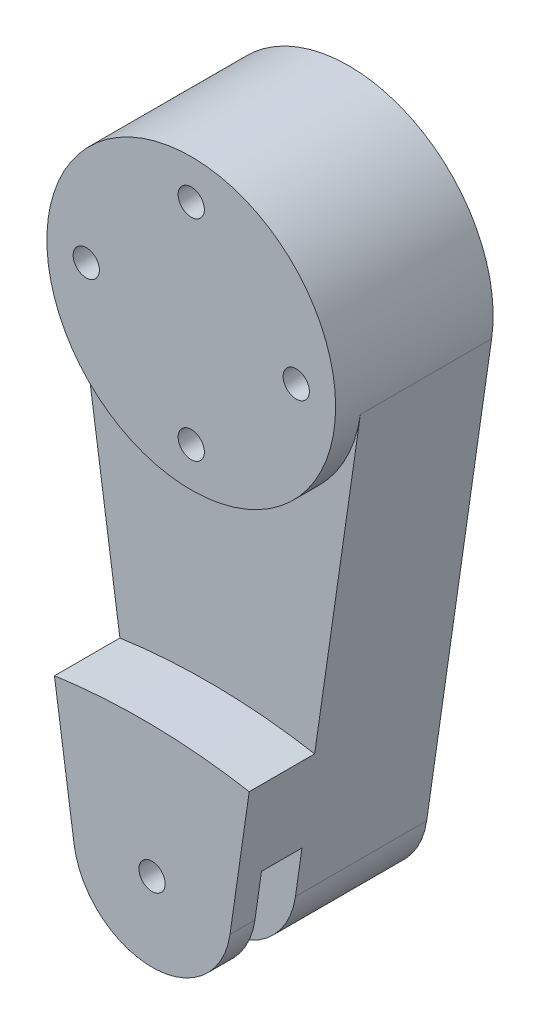
ISO-10303-21;
HEADER;
FILE_DESCRIPTION(('STEP AP214'),'2;1');
FILE_NAME('part.step','',(''),(''),'','','');
FILE_SCHEMA(('AUTOMOTIVE_DESIGN { 1 0 10303 214 1 1 1 1 }'));
ENDSEC;
DATA;
#1=APPLICATION_CONTEXT('core data for automotive mechanical design processes');
#2=APPLICATION_PROTOCOL_DEFINITION('international standard','automotive_design',2000,#1);
#3=PRODUCT_CONTEXT('',#1,'mechanical');
#4=PRODUCT('Part','Part','',(#3));
#5=PRODUCT_RELATED_PRODUCT_CATEGORY('part','',(#4));
#6=PRODUCT_DEFINITION_FORMATION('','',#4);
#7=PRODUCT_DEFINITION_CONTEXT('part definition',#1,'design');
#8=PRODUCT_DEFINITION('design','',#6,#7);
#9=PRODUCT_DEFINITION_SHAPE('','',#8);
#10=(LENGTH_UNIT() NAMED_UNIT(*) SI_UNIT(.MILLI.,.METRE.));
#11=(NAMED_UNIT(*) PLANE_ANGLE_UNIT() SI_UNIT($,.RADIAN.));
#12=(NAMED_UNIT(*) SI_UNIT($,.STERADIAN.) SOLID_ANGLE_UNIT());
#13=UNCERTAINTY_MEASURE_WITH_UNIT(LENGTH_MEASURE(1.E-05),#10,'distance_accuracy_value','');
#14=(GEOMETRIC_REPRESENTATION_CONTEXT(3) GLOBAL_UNCERTAINTY_ASSIGNED_CONTEXT((#13)) GLOBAL_UNIT_ASSIGNED_CONTEXT((#10,
#11,#12)) REPRESENTATION_CONTEXT('',''));
#15=CARTESIAN_POINT('',(0.,0.,0.));
#16=DIRECTION('',(0.,0.,1.));
#17=DIRECTION('',(1.,0.,0.));
#18=AXIS2_PLACEMENT_3D('',#15,#16,#17);
#19=CARTESIAN_POINT('',(-64.3745550146432,-324.,139.860706448977));
#20=DIRECTION('',(-0.612914989874306,0.790148856347574,0.));
#21=DIRECTION('',(-0.790148856347574,-0.612914989874306,0.));
#22=AXIS2_PLACEMENT_3D('',#19,#20,#21);
#23=PLANE('',#22);
#24=DIRECTION('',(0.790148856347574,0.612914989874306,0.));
#25=VECTOR('',#24,1.);
#26=CARTESIAN_POINT('',(-64.3745550146432,-324.,130.860706448977));
#27=LINE('',#26,#25);
#28=CARTESIAN_POINT('',(-64.3745550146432,-324.,130.860706448977));
#29=VERTEX_POINT('',#28);
#30=CARTESIAN_POINT('',(-36.7748993924584,-302.591068619146,130.860706448977));
#31=VERTEX_POINT('',#30);
#32=EDGE_CURVE('E60',#29,#31,#27,.T.);
#33=ORIENTED_EDGE('',*,*,#32,.F.);
#34=DIRECTION('',(0.,0.,-1.));
#35=VECTOR('',#34,1.);
#36=CARTESIAN_POINT('',(-64.3745550146432,-324.,139.860706448977));
#37=LINE('',#36,#35);
#38=CARTESIAN_POINT('',(-64.3745550146432,-324.,100.));
#39=VERTEX_POINT('',#38);
#40=EDGE_CURVE('E200',#29,#39,#37,.T.);
#41=ORIENTED_EDGE('',*,*,#40,.T.);
#42=DIRECTION('',(0.790148856347574,0.612914989874306,0.));
#43=VECTOR('',#42,1.);
#44=CARTESIAN_POINT('',(-64.3745550146432,-324.,100.));
#45=LINE('',#44,#43);
#46=CARTESIAN_POINT('',(-36.7748993924584,-302.591068619146,100.));
#47=VERTEX_POINT('',#46);
#48=EDGE_CURVE('E177',#39,#47,#45,.T.);
#49=ORIENTED_EDGE('',*,*,#48,.T.);
#50=DIRECTION('',(0.,0.,-1.));
#51=VECTOR('',#50,1.);
#52=CARTESIAN_POINT('',(-36.7748993924584,-302.591068619146,139.860706448977));
#53=LINE('',#52,#51);
#54=EDGE_CURVE('E199',#31,#47,#53,.T.);
#55=ORIENTED_EDGE('',*,*,#54,.F.);
#56=EDGE_LOOP('',(#33,#41,#49,#55));
#57=FACE_BOUND('',#56,.T.);
#58=ADVANCED_FACE('F41',(#57),#23,.F.);
#59=CARTESIAN_POINT('',(0.,-350.,139.860706448977));
#60=DIRECTION('',(0.,0.,-1.));
#61=DIRECTION('',(-1.,0.,0.));
#62=AXIS2_PLACEMENT_3D('',#59,#60,#61);
#63=CYLINDRICAL_SURFACE('',#62,60.);
#64=CARTESIAN_POINT('',(0.,-350.,130.860706448977));
#65=DIRECTION('',(0.,0.,1.));
#66=DIRECTION('',(1.,0.,0.));
#67=AXIS2_PLACEMENT_3D('',#64,#65,#66);
#68=CIRCLE('',#67,60.);
#69=CARTESIAN_POINT('',(36.7748993924584,-302.591068619146,130.860706448977));
#70=VERTEX_POINT('',#69);
#71=EDGE_CURVE('E63',#31,#70,#68,.F.);
#72=ORIENTED_EDGE('',*,*,#71,.F.);
#73=ORIENTED_EDGE('',*,*,#54,.T.);
#74=CARTESIAN_POINT('',(0.,-350.,100.));
#75=DIRECTION('',(0.,0.,-1.));
#76=DIRECTION('',(1.,0.,0.));
#77=AXIS2_PLACEMENT_3D('',#74,#75,#76);
#78=CIRCLE('',#77,60.);
#79=CARTESIAN_POINT('',(36.7748993924584,-302.591068619146,100.));
#80=VERTEX_POINT('',#79);
#81=EDGE_CURVE('E185',#47,#80,#78,.T.);
#82=ORIENTED_EDGE('',*,*,#81,.T.);
#83=DIRECTION('',(0.,0.,-1.));
#84=VECTOR('',#83,1.);
#85=CARTESIAN_POINT('',(36.7748993924584,-302.591068619146,139.860706448977));
#86=LINE('',#85,#84);
#87=EDGE_CURVE('E196',#70,#80,#86,.T.);
#88=ORIENTED_EDGE('',*,*,#87,.F.);
#89=EDGE_LOOP('',(#72,#73,#82,#88));
#90=FACE_BOUND('',#89,.T.);
#91=ADVANCED_FACE('F298',(#90),#63,.F.);
#92=CARTESIAN_POINT('',(64.3745550146433,-324.,139.860706448977));
#93=DIRECTION('',(0.612914989874306,0.790148856347574,0.));
#94=DIRECTION('',(-0.790148856347574,0.612914989874307,0.));
#95=AXIS2_PLACEMENT_3D('',#92,#93,#94);
#96=PLANE('',#95);
#97=DIRECTION('',(0.790148856347574,-0.612914989874307,0.));
#98=VECTOR('',#97,1.);
#99=CARTESIAN_POINT('',(64.3745550146433,-324.,130.860706448977));
#100=LINE('',#99,#98);
#101=CARTESIAN_POINT('',(64.3745550146433,-324.,130.860706448977));
#102=VERTEX_POINT('',#101);
#103=EDGE_CURVE('E173',#70,#102,#100,.T.);
#104=ORIENTED_EDGE('',*,*,#103,.F.);
#105=ORIENTED_EDGE('',*,*,#87,.T.);
#106=DIRECTION('',(0.790148856347574,-0.612914989874306,0.));
#107=VECTOR('',#106,1.);
#108=CARTESIAN_POINT('',(64.3745550146433,-324.,100.));
#109=LINE('',#108,#107);
#110=CARTESIAN_POINT('',(64.3745550146433,-324.,100.));
#111=VERTEX_POINT('',#110);
#112=EDGE_CURVE('E184',#80,#111,#109,.T.);
#113=ORIENTED_EDGE('',*,*,#112,.T.);
#114=DIRECTION('',(0.,0.,-1.));
#115=VECTOR('',#114,1.);
#116=CARTESIAN_POINT('',(64.3745550146433,-324.,139.860706448977));
#117=LINE('',#116,#115);
#118=EDGE_CURVE('E191',#102,#111,#117,.T.);
#119=ORIENTED_EDGE('',*,*,#118,.F.);
#120=EDGE_LOOP('',(#104,#105,#113,#119));
#121=FACE_BOUND('',#120,.T.);
#122=ADVANCED_FACE('F294',(#121),#96,.F.);
#123=CARTESIAN_POINT('',(0.,-350.,100.));
#124=DIRECTION('',(0.,0.,1.));
#125=DIRECTION('',(1.,0.,0.));
#126=AXIS2_PLACEMENT_3D('',#123,#124,#125);
#127=PLANE('',#126);
#128=CARTESIAN_POINT('',(-7.21687836487018,-720.,100.));
#129=DIRECTION('',(0.,0.,1.));
#130=DIRECTION('',(-1.,0.,0.));
#131=AXIS2_PLACEMENT_3D('',#128,#129,#130);
#132=CIRCLE('',#131,470.);
#133=CARTESIAN_POINT('',(74.0341464313362,-257.076387543726,100.));
#134=VERTEX_POINT('',#133);
#135=CARTESIAN_POINT('',(-74.3597355077275,-254.82064025293,100.));
#136=VERTEX_POINT('',#135);
#137=EDGE_CURVE('E189',#134,#136,#132,.T.);
#138=ORIENTED_EDGE('',*,*,#137,.F.);
#139=DIRECTION('',(0.142857142857143,0.989743318610787,0.));
#140=VECTOR('',#139,1.);
#141=CARTESIAN_POINT('',(59.3845991166472,-358.571428571429,100.));
#142=LINE('',#141,#140);
#143=CARTESIAN_POINT('',(108.871765047187,-15.7142857142858,100.));
#144=VERTEX_POINT('',#143);
#145=EDGE_CURVE('E244',#134,#144,#142,.T.);
#146=ORIENTED_EDGE('',*,*,#145,.T.);
#147=CARTESIAN_POINT('',(0.,0.,100.));
#148=DIRECTION('',(0.,0.,1.));
#149=DIRECTION('',(1.,0.,0.));
#150=AXIS2_PLACEMENT_3D('',#147,#148,#149);
#151=CIRCLE('',#150,110.);
#152=CARTESIAN_POINT('',(-108.871765047187,-15.7142857142857,100.));
#153=VERTEX_POINT('',#152);
#154=EDGE_CURVE('E232',#153,#144,#151,.T.);
#155=ORIENTED_EDGE('',*,*,#154,.F.);
#156=DIRECTION('',(0.142857142857143,-0.989743318610787,0.));
#157=VECTOR('',#156,1.);
#158=CARTESIAN_POINT('',(-59.3845991166472,-358.571428571429,100.));
#159=LINE('',#158,#157);
#160=EDGE_CURVE('E252',#153,#136,#159,.T.);
#161=ORIENTED_EDGE('',*,*,#160,.T.);
#162=EDGE_LOOP('',(#138,#146,#155,#161));
#163=FACE_BOUND('',#162,.T.);
#164=ADVANCED_FACE('F344',(#163),#127,.T.);
#165=CARTESIAN_POINT('',(0.,-350.,100.));
#166=DIRECTION('',(0.,0.,1.));
#167=DIRECTION('',(1.,0.,0.));
#168=AXIS2_PLACEMENT_3D('',#165,#166,#167);
#169=CIRCLE('',#168,10.);
#170=CARTESIAN_POINT('',(-10.,-350.,100.));
#171=VERTEX_POINT('',#170);
#172=EDGE_CURVE('E44',#171,#171,#169,.F.);
#173=ORIENTED_EDGE('',*,*,#172,.T.);
#174=EDGE_LOOP('',(#173));
#175=FACE_BOUND('',#174,.T.);
#176=ORIENTED_EDGE('',*,*,#112,.F.);
#177=ORIENTED_EDGE('',*,*,#81,.F.);
#178=ORIENTED_EDGE('',*,*,#48,.F.);
#179=CARTESIAN_POINT('',(-59.3845991166472,-358.571428571429,100.));
#180=VERTEX_POINT('',#179);
#181=EDGE_CURVE('E249',#39,#180,#159,.T.);
#182=ORIENTED_EDGE('',*,*,#181,.T.);
#183=CARTESIAN_POINT('',(0.,-350.,100.));
#184=DIRECTION('',(0.,0.,1.));
#185=DIRECTION('',(1.,0.,0.));
#186=AXIS2_PLACEMENT_3D('',#183,#184,#185);
#187=CIRCLE('',#186,60.);
#188=CARTESIAN_POINT('',(59.3845991166472,-358.571428571429,100.));
#189=VERTEX_POINT('',#188);
#190=EDGE_CURVE('E245',#180,#189,#187,.T.);
#191=ORIENTED_EDGE('',*,*,#190,.T.);
#192=EDGE_CURVE('E250',#189,#111,#142,.T.);
#193=ORIENTED_EDGE('',*,*,#192,.T.);
#194=EDGE_LOOP('',(#176,#177,#178,#182,#191,#193));
#195=FACE_BOUND('',#194,.T.);
#196=ADVANCED_FACE('F287',(#175,#195),#127,.T.);
#197=CARTESIAN_POINT('',(0.,-350.,100.));
#198=DIRECTION('',(0.,0.,-1.));
#199=DIRECTION('',(-1.,0.,0.));
#200=AXIS2_PLACEMENT_3D('',#197,#198,#199);
#201=CYLINDRICAL_SURFACE('',#200,60.);
#202=CARTESIAN_POINT('',(0.,-350.,0.));
#203=DIRECTION('',(0.,0.,1.));
#204=DIRECTION('',(1.,0.,0.));
#205=AXIS2_PLACEMENT_3D('',#202,#203,#204);
#206=CIRCLE('',#205,60.);
#207=CARTESIAN_POINT('',(-59.3845991166472,-358.571428571429,0.));
#208=VERTEX_POINT('',#207);
#209=CARTESIAN_POINT('',(59.3845991166472,-358.571428571429,0.));
#210=VERTEX_POINT('',#209);
#211=EDGE_CURVE('E237',#208,#210,#206,.T.);
#212=ORIENTED_EDGE('',*,*,#211,.T.);
#213=DIRECTION('',(0.,0.,-1.));
#214=VECTOR('',#213,1.);
#215=CARTESIAN_POINT('',(59.3845991166472,-358.571428571429,100.));
#216=LINE('',#215,#214);
#217=EDGE_CURVE('E11',#189,#210,#216,.T.);
#218=ORIENTED_EDGE('',*,*,#217,.F.);
#219=ORIENTED_EDGE('',*,*,#190,.F.);
#220=DIRECTION('',(0.,0.,-1.));
#221=VECTOR('',#220,1.);
#222=CARTESIAN_POINT('',(-59.3845991166472,-358.571428571429,100.));
#223=LINE('',#222,#221);
#224=EDGE_CURVE('E251',#180,#208,#223,.T.);
#225=ORIENTED_EDGE('',*,*,#224,.T.);
#226=EDGE_LOOP('',(#212,#218,#219,#225));
#227=FACE_BOUND('',#226,.T.);
#228=ADVANCED_FACE('F43',(#227),#201,.T.);
#229=CARTESIAN_POINT('',(59.3845991166472,-358.571428571429,100.));
#230=DIRECTION('',(-0.989743318610787,0.142857142857143,0.));
#231=DIRECTION('',(-0.142857142857143,-0.989743318610787,0.));
#232=AXIS2_PLACEMENT_3D('',#229,#230,#231);
#233=PLANE('',#232);
#234=DIRECTION('',(0.,0.,-1.));
#235=VECTOR('',#234,1.);
#236=CARTESIAN_POINT('',(74.0341464313362,-257.076387543726,139.860706448977));
#237=LINE('',#236,#235);
#238=CARTESIAN_POINT('',(74.0341464313363,-257.076387543726,149.860706448977));
#239=VERTEX_POINT('',#238);
#240=EDGE_CURVE('E148',#239,#134,#237,.T.);
#241=ORIENTED_EDGE('',*,*,#240,.F.);
#242=DIRECTION('',(0.142857142857143,0.989743318610787,0.));
#243=VECTOR('',#242,1.);
#244=CARTESIAN_POINT('',(74.0341464313362,-257.076387543726,149.860706448977));
#245=LINE('',#244,#243);
#246=CARTESIAN_POINT('',(59.3845991166472,-358.571428571429,149.860706448977));
#247=VERTEX_POINT('',#246);
#248=EDGE_CURVE('E150',#247,#239,#245,.T.);
#249=ORIENTED_EDGE('',*,*,#248,.F.);
#250=DIRECTION('',(0.,0.,1.));
#251=VECTOR('',#250,1.);
#252=CARTESIAN_POINT('',(59.3845991166472,-358.571428571429,130.860706448977));
#253=LINE('',#252,#251);
#254=CARTESIAN_POINT('',(59.3845991166472,-358.571428571429,130.860706448977));
#255=VERTEX_POINT('',#254);
#256=EDGE_CURVE('E132',#255,#247,#253,.T.);
#257=ORIENTED_EDGE('',*,*,#256,.F.);
#258=DIRECTION('',(0.142857142857143,0.989743318610787,0.));
#259=VECTOR('',#258,1.);
#260=CARTESIAN_POINT('',(74.0341464313362,-257.076387543726,130.860706448977));
#261=LINE('',#260,#259);
#262=EDGE_CURVE('E167',#255,#102,#261,.T.);
#263=ORIENTED_EDGE('',*,*,#262,.T.);
#264=ORIENTED_EDGE('',*,*,#118,.T.);
#265=ORIENTED_EDGE('',*,*,#192,.F.);
#266=ORIENTED_EDGE('',*,*,#217,.T.);
#267=DIRECTION('',(0.142857142857143,0.989743318610787,0.));
#268=VECTOR('',#267,1.);
#269=CARTESIAN_POINT('',(59.3845991166472,-358.571428571429,0.));
#270=LINE('',#269,#268);
#271=CARTESIAN_POINT('',(108.871765047187,-15.7142857142858,0.));
#272=VERTEX_POINT('',#271);
#273=EDGE_CURVE('E260',#210,#272,#270,.T.);
#274=ORIENTED_EDGE('',*,*,#273,.T.);
#275=DIRECTION('',(0.,0.,-1.));
#276=VECTOR('',#275,1.);
#277=CARTESIAN_POINT('',(108.871765047187,-15.7142857142858,100.));
#278=LINE('',#277,#276);
#279=EDGE_CURVE('E49',#144,#272,#278,.T.);
#280=ORIENTED_EDGE('',*,*,#279,.F.);
#281=ORIENTED_EDGE('',*,*,#145,.F.);
#282=EDGE_LOOP('',(#241,#249,#257,#263,#264,#265,#266,#274,#280,#281));
#283=FACE_BOUND('',#282,.T.);
#284=ADVANCED_FACE('F149',(#283),#233,.F.);
#285=CARTESIAN_POINT('',(0.,0.,100.));
#286=DIRECTION('',(0.,0.,-1.));
#287=DIRECTION('',(-1.,0.,0.));
#288=AXIS2_PLACEMENT_3D('',#285,#286,#287);
#289=CYLINDRICAL_SURFACE('',#288,110.);
#290=CARTESIAN_POINT('',(0.,0.,0.));
#291=DIRECTION('',(0.,0.,1.));
#292=DIRECTION('',(1.,0.,0.));
#293=AXIS2_PLACEMENT_3D('',#290,#291,#292);
#294=CIRCLE('',#293,110.);
#295=CARTESIAN_POINT('',(-108.871765047187,-15.7142857142857,0.));
#296=VERTEX_POINT('',#295);
#297=EDGE_CURVE('E256',#272,#296,#294,.T.);
#298=ORIENTED_EDGE('',*,*,#297,.T.);
#299=DIRECTION('',(0.,0.,-1.));
#300=VECTOR('',#299,1.);
#301=CARTESIAN_POINT('',(-108.871765047187,-15.7142857142857,100.));
#302=LINE('',#301,#300);
#303=EDGE_CURVE('E263',#153,#296,#302,.T.);
#304=ORIENTED_EDGE('',*,*,#303,.F.);
#305=ORIENTED_EDGE('',*,*,#154,.T.);
#306=ORIENTED_EDGE('',*,*,#279,.T.);
#307=EDGE_LOOP('',(#298,#304,#305,#306));
#308=FACE_BOUND('',#307,.T.);
#309=CARTESIAN_POINT('',(0.,0.,120.));
#310=DIRECTION('',(0.,0.,1.));
#311=DIRECTION('',(1.,0.,0.));
#312=AXIS2_PLACEMENT_3D('',#309,#310,#311);
#313=CIRCLE('',#312,110.);
#314=CARTESIAN_POINT('',(110.,0.,120.));
#315=VERTEX_POINT('',#314);
#316=EDGE_CURVE('E236',#315,#315,#313,.T.);
#317=ORIENTED_EDGE('',*,*,#316,.F.);
#318=EDGE_LOOP('',(#317));
#319=FACE_BOUND('',#318,.T.);
#320=ADVANCED_FACE('F272',(#308,#319),#289,.T.);
#321=CARTESIAN_POINT('',(-59.3845991166472,-358.571428571429,100.));
#322=DIRECTION('',(0.989743318610787,0.142857142857143,0.));
#323=DIRECTION('',(-0.142857142857143,0.989743318610787,0.));
#324=AXIS2_PLACEMENT_3D('',#321,#322,#323);
#325=PLANE('',#324);
#326=ORIENTED_EDGE('',*,*,#40,.F.);
#327=DIRECTION('',(0.142857142857143,-0.989743318610787,0.));
#328=VECTOR('',#327,1.);
#329=CARTESIAN_POINT('',(-59.3845991166472,-358.571428571429,130.860706448977));
#330=LINE('',#329,#328);
#331=CARTESIAN_POINT('',(-59.3845991166472,-358.571428571429,130.860706448977));
#332=VERTEX_POINT('',#331);
#333=EDGE_CURVE('E144',#29,#332,#330,.T.);
#334=ORIENTED_EDGE('',*,*,#333,.T.);
#335=DIRECTION('',(0.,0.,1.));
#336=VECTOR('',#335,1.);
#337=CARTESIAN_POINT('',(-59.3845991166472,-358.571428571429,130.860706448977));
#338=LINE('',#337,#336);
#339=CARTESIAN_POINT('',(-59.3845991166472,-358.571428571429,149.860706448977));
#340=VERTEX_POINT('',#339);
#341=EDGE_CURVE('E141',#332,#340,#338,.T.);
#342=ORIENTED_EDGE('',*,*,#341,.T.);
#343=DIRECTION('',(0.142857142857143,-0.989743318610787,0.));
#344=VECTOR('',#343,1.);
#345=CARTESIAN_POINT('',(-59.3845991166472,-358.571428571429,149.860706448977));
#346=LINE('',#345,#344);
#347=CARTESIAN_POINT('',(-74.3597355077274,-254.82064025293,149.860706448977));
#348=VERTEX_POINT('',#347);
#349=EDGE_CURVE('E160',#348,#340,#346,.T.);
#350=ORIENTED_EDGE('',*,*,#349,.F.);
#351=DIRECTION('',(0.,0.,-1.));
#352=VECTOR('',#351,1.);
#353=CARTESIAN_POINT('',(-74.3597355077275,-254.82064025293,139.860706448977));
#354=LINE('',#353,#352);
#355=EDGE_CURVE('E192',#348,#136,#354,.T.);
#356=ORIENTED_EDGE('',*,*,#355,.T.);
#357=ORIENTED_EDGE('',*,*,#160,.F.);
#358=ORIENTED_EDGE('',*,*,#303,.T.);
#359=DIRECTION('',(0.142857142857143,-0.989743318610787,0.));
#360=VECTOR('',#359,1.);
#361=CARTESIAN_POINT('',(-59.3845991166472,-358.571428571429,0.));
#362=LINE('',#361,#360);
#363=EDGE_CURVE('E246',#296,#208,#362,.T.);
#364=ORIENTED_EDGE('',*,*,#363,.T.);
#365=ORIENTED_EDGE('',*,*,#224,.F.);
#366=ORIENTED_EDGE('',*,*,#181,.F.);
#367=EDGE_LOOP('',(#326,#334,#342,#350,#356,#357,#358,#364,#365,#366));
#368=FACE_BOUND('',#367,.T.);
#369=ADVANCED_FACE('F281',(#368),#325,.F.);
#370=CARTESIAN_POINT('',(0.,-350.,0.));
#371=DIRECTION('',(0.,0.,1.));
#372=DIRECTION('',(1.,0.,0.));
#373=AXIS2_PLACEMENT_3D('',#370,#371,#372);
#374=PLANE('',#373);
#375=CARTESIAN_POINT('',(0.,0.,0.));
#376=DIRECTION('',(0.,0.,1.));
#377=DIRECTION('',(1.,0.,0.));
#378=AXIS2_PLACEMENT_3D('',#375,#376,#377);
#379=CIRCLE('',#378,10.);
#380=CARTESIAN_POINT('',(10.,0.,0.));
#381=VERTEX_POINT('',#380);
#382=EDGE_CURVE('E204',#381,#381,#379,.T.);
#383=ORIENTED_EDGE('',*,*,#382,.T.);
#384=EDGE_LOOP('',(#383));
#385=FACE_BOUND('',#384,.T.);
#386=CARTESIAN_POINT('',(80.,0.,0.));
#387=DIRECTION('',(0.,0.,1.));
#388=DIRECTION('',(1.,0.,0.));
#389=AXIS2_PLACEMENT_3D('',#386,#387,#388);
#390=CIRCLE('',#389,9.99999999999999);
#391=CARTESIAN_POINT('',(90.,0.,0.));
#392=VERTEX_POINT('',#391);
#393=EDGE_CURVE('E211',#392,#392,#390,.T.);
#394=ORIENTED_EDGE('',*,*,#393,.T.);
#395=EDGE_LOOP('',(#394));
#396=FACE_BOUND('',#395,.T.);
#397=CARTESIAN_POINT('',(0.,80.,0.));
#398=DIRECTION('',(0.,0.,1.));
#399=DIRECTION('',(1.,0.,0.));
#400=AXIS2_PLACEMENT_3D('',#397,#398,#399);
#401=CIRCLE('',#400,10.);
#402=CARTESIAN_POINT('',(9.99999999999999,80.,0.));
#403=VERTEX_POINT('',#402);
#404=EDGE_CURVE('E220',#403,#403,#401,.T.);
#405=ORIENTED_EDGE('',*,*,#404,.T.);
#406=EDGE_LOOP('',(#405));
#407=FACE_BOUND('',#406,.T.);
#408=CARTESIAN_POINT('',(0.,-80.,0.));
#409=DIRECTION('',(0.,0.,1.));
#410=DIRECTION('',(1.,0.,0.));
#411=AXIS2_PLACEMENT_3D('',#408,#409,#410);
#412=CIRCLE('',#411,10.);
#413=CARTESIAN_POINT('',(10.,-80.,0.));
#414=VERTEX_POINT('',#413);
#415=EDGE_CURVE('E228',#414,#414,#412,.T.);
#416=ORIENTED_EDGE('',*,*,#415,.T.);
#417=EDGE_LOOP('',(#416));
#418=FACE_BOUND('',#417,.T.);
#419=CARTESIAN_POINT('',(-80.,0.,0.));
#420=DIRECTION('',(0.,0.,1.));
#421=DIRECTION('',(1.,0.,0.));
#422=AXIS2_PLACEMENT_3D('',#419,#420,#421);
#423=CIRCLE('',#422,9.99999999999999);
#424=CARTESIAN_POINT('',(-70.,0.,0.));
#425=VERTEX_POINT('',#424);
#426=EDGE_CURVE('E235',#425,#425,#423,.T.);
#427=ORIENTED_EDGE('',*,*,#426,.T.);
#428=EDGE_LOOP('',(#427));
#429=FACE_BOUND('',#428,.T.);
#430=ORIENTED_EDGE('',*,*,#211,.F.);
#431=ORIENTED_EDGE('',*,*,#363,.F.);
#432=ORIENTED_EDGE('',*,*,#297,.F.);
#433=ORIENTED_EDGE('',*,*,#273,.F.);
#434=EDGE_LOOP('',(#430,#431,#432,#433));
#435=FACE_BOUND('',#434,.T.);
#436=ADVANCED_FACE('F279',(#385,#396,#407,#418,#429,#435),#374,.F.);
#437=CARTESIAN_POINT('',(0.,0.,120.));
#438=DIRECTION('',(0.,0.,1.));
#439=DIRECTION('',(1.,0.,0.));
#440=AXIS2_PLACEMENT_3D('',#437,#438,#439);
#441=PLANE('',#440);
#442=CARTESIAN_POINT('',(80.,0.,120.));
#443=DIRECTION('',(0.,0.,1.));
#444=DIRECTION('',(1.,0.,0.));
#445=AXIS2_PLACEMENT_3D('',#442,#443,#444);
#446=CIRCLE('',#445,10.);
#447=CARTESIAN_POINT('',(90.,0.,120.));
#448=VERTEX_POINT('',#447);
#449=EDGE_CURVE('E212',#448,#448,#446,.T.);
#450=ORIENTED_EDGE('',*,*,#449,.F.);
#451=EDGE_LOOP('',(#450));
#452=FACE_BOUND('',#451,.T.);
#453=CARTESIAN_POINT('',(0.,80.,120.));
#454=DIRECTION('',(0.,0.,1.));
#455=DIRECTION('',(1.,0.,0.));
#456=AXIS2_PLACEMENT_3D('',#453,#454,#455);
#457=CIRCLE('',#456,10.);
#458=CARTESIAN_POINT('',(10.,80.,120.));
#459=VERTEX_POINT('',#458);
#460=EDGE_CURVE('E217',#459,#459,#457,.T.);
#461=ORIENTED_EDGE('',*,*,#460,.F.);
#462=EDGE_LOOP('',(#461));
#463=FACE_BOUND('',#462,.T.);
#464=CARTESIAN_POINT('',(0.,-80.,120.));
#465=DIRECTION('',(0.,0.,1.));
#466=DIRECTION('',(1.,0.,0.));
#467=AXIS2_PLACEMENT_3D('',#464,#465,#466);
#468=CIRCLE('',#467,10.);
#469=CARTESIAN_POINT('',(10.,-80.,120.));
#470=VERTEX_POINT('',#469);
#471=EDGE_CURVE('E222',#470,#470,#468,.T.);
#472=ORIENTED_EDGE('',*,*,#471,.F.);
#473=EDGE_LOOP('',(#472));
#474=FACE_BOUND('',#473,.T.);
#475=CARTESIAN_POINT('',(-80.,0.,120.));
#476=DIRECTION('',(0.,0.,1.));
#477=DIRECTION('',(1.,0.,0.));
#478=AXIS2_PLACEMENT_3D('',#475,#476,#477);
#479=CIRCLE('',#478,10.);
#480=CARTESIAN_POINT('',(-70.,0.,120.));
#481=VERTEX_POINT('',#480);
#482=EDGE_CURVE('E230',#481,#481,#479,.T.);
#483=ORIENTED_EDGE('',*,*,#482,.F.);
#484=EDGE_LOOP('',(#483));
#485=FACE_BOUND('',#484,.T.);
#486=ORIENTED_EDGE('',*,*,#316,.T.);
#487=EDGE_LOOP('',(#486));
#488=FACE_BOUND('',#487,.T.);
#489=ADVANCED_FACE('F336',(#452,#463,#474,#485,#488),#441,.T.);
#490=CARTESIAN_POINT('',(-80.,0.,120.));
#491=DIRECTION('',(0.,0.,1.));
#492=DIRECTION('',(1.,0.,0.));
#493=AXIS2_PLACEMENT_3D('',#490,#491,#492);
#494=CYLINDRICAL_SURFACE('',#493,10.);
#495=ORIENTED_EDGE('',*,*,#426,.F.);
#496=EDGE_LOOP('',(#495));
#497=FACE_BOUND('',#496,.T.);
#498=ORIENTED_EDGE('',*,*,#482,.T.);
#499=EDGE_LOOP('',(#498));
#500=FACE_BOUND('',#499,.T.);
#501=ADVANCED_FACE('F335',(#497,#500),#494,.F.);
#502=CARTESIAN_POINT('',(0.,-80.,120.));
#503=DIRECTION('',(0.,0.,1.));
#504=DIRECTION('',(1.,0.,0.));
#505=AXIS2_PLACEMENT_3D('',#502,#503,#504);
#506=CYLINDRICAL_SURFACE('',#505,10.);
#507=ORIENTED_EDGE('',*,*,#415,.F.);
#508=EDGE_LOOP('',(#507));
#509=FACE_BOUND('',#508,.T.);
#510=ORIENTED_EDGE('',*,*,#471,.T.);
#511=EDGE_LOOP('',(#510));
#512=FACE_BOUND('',#511,.T.);
#513=ADVANCED_FACE('F330',(#509,#512),#506,.F.);
#514=CARTESIAN_POINT('',(0.,80.,120.));
#515=DIRECTION('',(0.,0.,1.));
#516=DIRECTION('',(1.,0.,0.));
#517=AXIS2_PLACEMENT_3D('',#514,#515,#516);
#518=CYLINDRICAL_SURFACE('',#517,10.);
#519=ORIENTED_EDGE('',*,*,#404,.F.);
#520=EDGE_LOOP('',(#519));
#521=FACE_BOUND('',#520,.T.);
#522=ORIENTED_EDGE('',*,*,#460,.T.);
#523=EDGE_LOOP('',(#522));
#524=FACE_BOUND('',#523,.T.);
#525=ADVANCED_FACE('F326',(#521,#524),#518,.F.);
#526=CARTESIAN_POINT('',(80.,0.,120.));
#527=DIRECTION('',(0.,0.,1.));
#528=DIRECTION('',(1.,0.,0.));
#529=AXIS2_PLACEMENT_3D('',#526,#527,#528);
#530=CYLINDRICAL_SURFACE('',#529,10.);
#531=ORIENTED_EDGE('',*,*,#393,.F.);
#532=EDGE_LOOP('',(#531));
#533=FACE_BOUND('',#532,.T.);
#534=ORIENTED_EDGE('',*,*,#449,.T.);
#535=EDGE_LOOP('',(#534));
#536=FACE_BOUND('',#535,.T.);
#537=ADVANCED_FACE('F325',(#533,#536),#530,.F.);
#538=CARTESIAN_POINT('',(0.,-350.,218.));
#539=DIRECTION('',(0.,0.,-1.));
#540=DIRECTION('',(-1.,0.,0.));
#541=AXIS2_PLACEMENT_3D('',#538,#539,#540);
#542=CYLINDRICAL_SURFACE('',#541,10.);
#543=CARTESIAN_POINT('',(0.,-350.,70.));
#544=DIRECTION('',(0.,0.,1.));
#545=DIRECTION('',(1.,0.,0.));
#546=AXIS2_PLACEMENT_3D('',#543,#544,#545);
#547=CIRCLE('',#546,10.);
#548=CARTESIAN_POINT('',(-10.,-350.,70.));
#549=VERTEX_POINT('',#548);
#550=EDGE_CURVE('E207',#549,#549,#547,.T.);
#551=CARTESIAN_POINT('',(-10.,-350.,100.));
#552=CARTESIAN_POINT('',(-10.,-350.,99.6875));
#553=CARTESIAN_POINT('',(-10.,-350.,99.375));
#554=CARTESIAN_POINT('',(-10.,-350.,98.75));
#555=CARTESIAN_POINT('',(-10.,-350.,98.4375));
#556=CARTESIAN_POINT('',(-10.,-350.,97.8125));
#557=CARTESIAN_POINT('',(-10.,-350.,97.5));
#558=CARTESIAN_POINT('',(-10.,-350.,96.875));
#559=CARTESIAN_POINT('',(-10.,-350.,96.5625));
#560=CARTESIAN_POINT('',(-10.,-350.,95.9375));
#561=CARTESIAN_POINT('',(-10.,-350.,95.625));
#562=CARTESIAN_POINT('',(-10.,-350.,95.));
#563=CARTESIAN_POINT('',(-10.,-350.,94.6875));
#564=CARTESIAN_POINT('',(-10.,-350.,94.0625));
#565=CARTESIAN_POINT('',(-10.,-350.,93.75));
#566=CARTESIAN_POINT('',(-10.,-350.,93.125));
#567=CARTESIAN_POINT('',(-10.,-350.,92.8125));
#568=CARTESIAN_POINT('',(-10.,-350.,92.1875));
#569=CARTESIAN_POINT('',(-10.,-350.,91.875));
#570=CARTESIAN_POINT('',(-10.,-350.,91.25));
#571=CARTESIAN_POINT('',(-10.,-350.,90.9375));
#572=CARTESIAN_POINT('',(-10.,-350.,90.3125));
#573=CARTESIAN_POINT('',(-10.,-350.,90.));
#574=CARTESIAN_POINT('',(-10.,-350.,89.375));
#575=CARTESIAN_POINT('',(-10.,-350.,89.0625));
#576=CARTESIAN_POINT('',(-10.,-350.,88.4375));
#577=CARTESIAN_POINT('',(-10.,-350.,88.125));
#578=CARTESIAN_POINT('',(-10.,-350.,87.5));
#579=CARTESIAN_POINT('',(-10.,-350.,87.1875));
#580=CARTESIAN_POINT('',(-10.,-350.,86.5625));
#581=CARTESIAN_POINT('',(-10.,-350.,86.25));
#582=CARTESIAN_POINT('',(-10.,-350.,85.625));
#583=CARTESIAN_POINT('',(-10.,-350.,85.3125));
#584=CARTESIAN_POINT('',(-10.,-350.,84.6875));
#585=CARTESIAN_POINT('',(-10.,-350.,84.375));
#586=CARTESIAN_POINT('',(-10.,-350.,83.75));
#587=CARTESIAN_POINT('',(-10.,-350.,83.4375));
#588=CARTESIAN_POINT('',(-10.,-350.,82.8125));
#589=CARTESIAN_POINT('',(-10.,-350.,82.5));
#590=CARTESIAN_POINT('',(-10.,-350.,81.875));
#591=CARTESIAN_POINT('',(-10.,-350.,81.5625));
#592=CARTESIAN_POINT('',(-10.,-350.,80.9375));
#593=CARTESIAN_POINT('',(-10.,-350.,80.625));
#594=CARTESIAN_POINT('',(-10.,-350.,80.));
#595=CARTESIAN_POINT('',(-10.,-350.,79.6875));
#596=CARTESIAN_POINT('',(-10.,-350.,79.0625));
#597=CARTESIAN_POINT('',(-10.,-350.,78.75));
#598=CARTESIAN_POINT('',(-10.,-350.,78.125));
#599=CARTESIAN_POINT('',(-10.,-350.,77.8125));
#600=CARTESIAN_POINT('',(-10.,-350.,77.1875));
#601=CARTESIAN_POINT('',(-10.,-350.,76.875));
#602=CARTESIAN_POINT('',(-10.,-350.,76.25));
#603=CARTESIAN_POINT('',(-10.,-350.,75.9375));
#604=CARTESIAN_POINT('',(-10.,-350.,75.3125));
#605=CARTESIAN_POINT('',(-10.,-350.,75.));
#606=CARTESIAN_POINT('',(-10.,-350.,74.375));
#607=CARTESIAN_POINT('',(-10.,-350.,74.0625));
#608=CARTESIAN_POINT('',(-10.,-350.,73.4375));
#609=CARTESIAN_POINT('',(-10.,-350.,73.125));
#610=CARTESIAN_POINT('',(-10.,-350.,72.5));
#611=CARTESIAN_POINT('',(-10.,-350.,72.1875));
#612=CARTESIAN_POINT('',(-10.,-350.,71.5625));
#613=CARTESIAN_POINT('',(-10.,-350.,71.25));
#614=CARTESIAN_POINT('',(-10.,-350.,70.625));
#615=CARTESIAN_POINT('',(-10.,-350.,70.3125));
#616=CARTESIAN_POINT('',(-10.,-350.,70.));
#617=B_SPLINE_CURVE_WITH_KNOTS('',3,(#551,#552,#553,#554,#555,#556,#557,#558,#559,#560,#561,
#562,#563,#564,#565,#566,#567,#568,#569,#570,#571,#572,#573,#574,#575,#576,#577,#578,#579,#580,
#581,#582,#583,#584,#585,#586,#587,#588,#589,#590,#591,#592,#593,#594,#595,#596,#597,#598,#599,
#600,#601,#602,#603,#604,#605,#606,#607,#608,#609,#610,#611,#612,#613,#614,#615,#616),
.UNSPECIFIED.,.F.,.F.,(4,2,2,2,2,2,2,2,2,2,2,2,2,2,2,2,2,2,2,2,2,2,2,2,2,2,2,2,2,2,2,2,4),(0.,
0.937500000000008,1.875,2.8125,3.75,4.68750000000001,5.62500000000001,6.5625,7.49999999999999,
8.4375,9.37500000000001,10.3125,11.25,12.1875,13.125,14.0625,15.,15.9375,16.875,17.8125,18.75,
19.6875,20.625,21.5625,22.5,23.4375,24.375,25.3125,26.25,27.1875,28.125,29.0625,30.),.UNSPECIFIED.);
#618=EDGE_CURVE('BSEAM319',#171,#549,#617,.T.);
#619=ORIENTED_EDGE('',*,*,#172,.F.);
#620=ORIENTED_EDGE('',*,*,#550,.F.);
#621=ORIENTED_EDGE('',*,*,#618,.T.);
#622=ORIENTED_EDGE('',*,*,#618,.F.);
#623=EDGE_LOOP('',(#619,#621,#620,#622));
#624=FACE_BOUND('',#623,.T.);
#625=ADVANCED_FACE('F319',(#624),#542,.F.);
#626=CARTESIAN_POINT('',(0.,-350.,70.));
#627=DIRECTION('',(0.,0.,1.));
#628=DIRECTION('',(1.,0.,0.));
#629=AXIS2_PLACEMENT_3D('',#626,#627,#628);
#630=PLANE('',#629);
#631=ORIENTED_EDGE('',*,*,#550,.T.);
#632=EDGE_LOOP('',(#631));
#633=FACE_BOUND('',#632,.T.);
#634=ADVANCED_FACE('F313',(#633),#630,.T.);
#635=CARTESIAN_POINT('',(0.,0.,110.));
#636=DIRECTION('',(0.,0.,-1.));
#637=DIRECTION('',(-1.,0.,0.));
#638=AXIS2_PLACEMENT_3D('',#635,#636,#637);
#639=CYLINDRICAL_SURFACE('',#638,10.);
#640=CARTESIAN_POINT('',(0.,0.,110.));
#641=DIRECTION('',(0.,0.,1.));
#642=DIRECTION('',(1.,0.,0.));
#643=AXIS2_PLACEMENT_3D('',#640,#641,#642);
#644=CIRCLE('',#643,10.);
#645=CARTESIAN_POINT('',(10.,0.,110.));
#646=VERTEX_POINT('',#645);
#647=EDGE_CURVE('E202',#646,#646,#644,.T.);
#648=ORIENTED_EDGE('',*,*,#647,.T.);
#649=EDGE_LOOP('',(#648));
#650=FACE_BOUND('',#649,.T.);
#651=ORIENTED_EDGE('',*,*,#382,.F.);
#652=EDGE_LOOP('',(#651));
#653=FACE_BOUND('',#652,.T.);
#654=ADVANCED_FACE('F309',(#650,#653),#639,.F.);
#655=CARTESIAN_POINT('',(0.,0.,110.));
#656=DIRECTION('',(0.,0.,1.));
#657=DIRECTION('',(1.,0.,0.));
#658=AXIS2_PLACEMENT_3D('',#655,#656,#657);
#659=PLANE('',#658);
#660=ORIENTED_EDGE('',*,*,#647,.F.);
#661=EDGE_LOOP('',(#660));
#662=FACE_BOUND('',#661,.T.);
#663=ADVANCED_FACE('F306',(#662),#659,.F.);
#664=CARTESIAN_POINT('',(-7.21687836487018,-720.,139.860706448977));
#665=DIRECTION('',(0.,0.,-1.));
#666=DIRECTION('',(-1.,0.,0.));
#667=AXIS2_PLACEMENT_3D('',#664,#665,#666);
#668=CYLINDRICAL_SURFACE('',#667,470.);
#669=ORIENTED_EDGE('',*,*,#240,.T.);
#670=ORIENTED_EDGE('',*,*,#137,.T.);
#671=ORIENTED_EDGE('',*,*,#355,.F.);
#672=CARTESIAN_POINT('',(-7.21687836487012,-720.000000000001,149.860706448977));
#673=DIRECTION('',(0.,0.,1.));
#674=DIRECTION('',(-1.,0.,0.));
#675=AXIS2_PLACEMENT_3D('',#672,#673,#674);
#676=CIRCLE('',#675,470.000000000001);
#677=EDGE_CURVE('E153',#239,#348,#676,.T.);
#678=ORIENTED_EDGE('',*,*,#677,.F.);
#679=EDGE_LOOP('',(#669,#670,#671,#678));
#680=FACE_BOUND('',#679,.T.);
#681=ADVANCED_FACE('F307',(#680),#668,.T.);
#682=CARTESIAN_POINT('',(0.,-350.,130.860706448977));
#683=DIRECTION('',(0.,0.,1.));
#684=DIRECTION('',(1.,0.,0.));
#685=AXIS2_PLACEMENT_3D('',#682,#683,#684);
#686=CYLINDRICAL_SURFACE('',#685,60.);
#687=ORIENTED_EDGE('',*,*,#256,.T.);
#688=CARTESIAN_POINT('',(0.,-350.,149.860706448977));
#689=DIRECTION('',(0.,0.,1.));
#690=DIRECTION('',(1.,0.,0.));
#691=AXIS2_PLACEMENT_3D('',#688,#689,#690);
#692=CIRCLE('',#691,60.);
#693=EDGE_CURVE('E139',#340,#247,#692,.T.);
#694=ORIENTED_EDGE('',*,*,#693,.F.);
#695=ORIENTED_EDGE('',*,*,#341,.F.);
#696=CARTESIAN_POINT('',(0.,-350.,130.860706448977));
#697=DIRECTION('',(0.,0.,1.));
#698=DIRECTION('',(1.,0.,0.));
#699=AXIS2_PLACEMENT_3D('',#696,#697,#698);
#700=CIRCLE('',#699,60.);
#701=EDGE_CURVE('E140',#332,#255,#700,.T.);
#702=ORIENTED_EDGE('',*,*,#701,.T.);
#703=EDGE_LOOP('',(#687,#694,#695,#702));
#704=FACE_BOUND('',#703,.T.);
#705=ADVANCED_FACE('F133',(#704),#686,.T.);
#706=CARTESIAN_POINT('',(0.,-350.,130.860706448977));
#707=DIRECTION('',(0.,0.,1.));
#708=DIRECTION('',(1.,0.,0.));
#709=AXIS2_PLACEMENT_3D('',#706,#707,#708);
#710=PLANE('',#709);
#711=CARTESIAN_POINT('',(0.,-350.,130.860706448977));
#712=DIRECTION('',(0.,0.,1.));
#713=DIRECTION('',(1.,0.,0.));
#714=AXIS2_PLACEMENT_3D('',#711,#712,#713);
#715=CIRCLE('',#714,10.);
#716=CARTESIAN_POINT('',(10.,-350.,130.860706448977));
#717=VERTEX_POINT('',#716);
#718=EDGE_CURVE('E156',#717,#717,#715,.T.);
#719=ORIENTED_EDGE('',*,*,#718,.T.);
#720=EDGE_LOOP('',(#719));
#721=FACE_BOUND('',#720,.T.);
#722=ORIENTED_EDGE('',*,*,#333,.F.);
#723=ORIENTED_EDGE('',*,*,#32,.T.);
#724=ORIENTED_EDGE('',*,*,#71,.T.);
#725=ORIENTED_EDGE('',*,*,#103,.T.);
#726=ORIENTED_EDGE('',*,*,#262,.F.);
#727=ORIENTED_EDGE('',*,*,#701,.F.);
#728=EDGE_LOOP('',(#722,#723,#724,#725,#726,#727));
#729=FACE_BOUND('',#728,.T.);
#730=ADVANCED_FACE('F291',(#721,#729),#710,.F.);
#731=CARTESIAN_POINT('',(0.,-350.,149.860706448977));
#732=DIRECTION('',(0.,0.,1.));
#733=DIRECTION('',(1.,0.,0.));
#734=AXIS2_PLACEMENT_3D('',#731,#732,#733);
#735=PLANE('',#734);
#736=CARTESIAN_POINT('',(0.,-350.,149.860706448977));
#737=DIRECTION('',(0.,0.,1.));
#738=DIRECTION('',(1.,0.,0.));
#739=AXIS2_PLACEMENT_3D('',#736,#737,#738);
#740=CIRCLE('',#739,10.);
#741=CARTESIAN_POINT('',(10.,-350.,149.860706448977));
#742=VERTEX_POINT('',#741);
#743=EDGE_CURVE('E161',#742,#742,#740,.T.);
#744=ORIENTED_EDGE('',*,*,#743,.F.);
#745=EDGE_LOOP('',(#744));
#746=FACE_BOUND('',#745,.T.);
#747=ORIENTED_EDGE('',*,*,#693,.T.);
#748=ORIENTED_EDGE('',*,*,#248,.T.);
#749=ORIENTED_EDGE('',*,*,#677,.T.);
#750=ORIENTED_EDGE('',*,*,#349,.T.);
#751=EDGE_LOOP('',(#747,#748,#749,#750));
#752=FACE_BOUND('',#751,.T.);
#753=ADVANCED_FACE('F159',(#746,#752),#735,.T.);
#754=CARTESIAN_POINT('',(0.,-350.,99.8607064489767));
#755=DIRECTION('',(0.,0.,1.));
#756=DIRECTION('',(1.,0.,0.));
#757=AXIS2_PLACEMENT_3D('',#754,#755,#756);
#758=CYLINDRICAL_SURFACE('',#757,10.);
#759=ORIENTED_EDGE('',*,*,#743,.T.);
#760=EDGE_LOOP('',(#759));
#761=FACE_BOUND('',#760,.T.);
#762=ORIENTED_EDGE('',*,*,#718,.F.);
#763=EDGE_LOOP('',(#762));
#764=FACE_BOUND('',#763,.T.);
#765=ADVANCED_FACE('F491',(#761,#764),#758,.F.);
#766=CLOSED_SHELL('',(#58,#91,#122,#164,#196,#228,#284,#320,#369,#436,#489,#501,#513,#525,#537,
#625,#634,#654,#663,#681,#705,#730,#753,#765));
#767=MANIFOLD_SOLID_BREP('B2',#766);
#768=ADVANCED_BREP_SHAPE_REPRESENTATION('',(#18,#767),#14);
#769=SHAPE_DEFINITION_REPRESENTATION(#9,#768);
ENDSEC;
END-ISO-10303-21;
